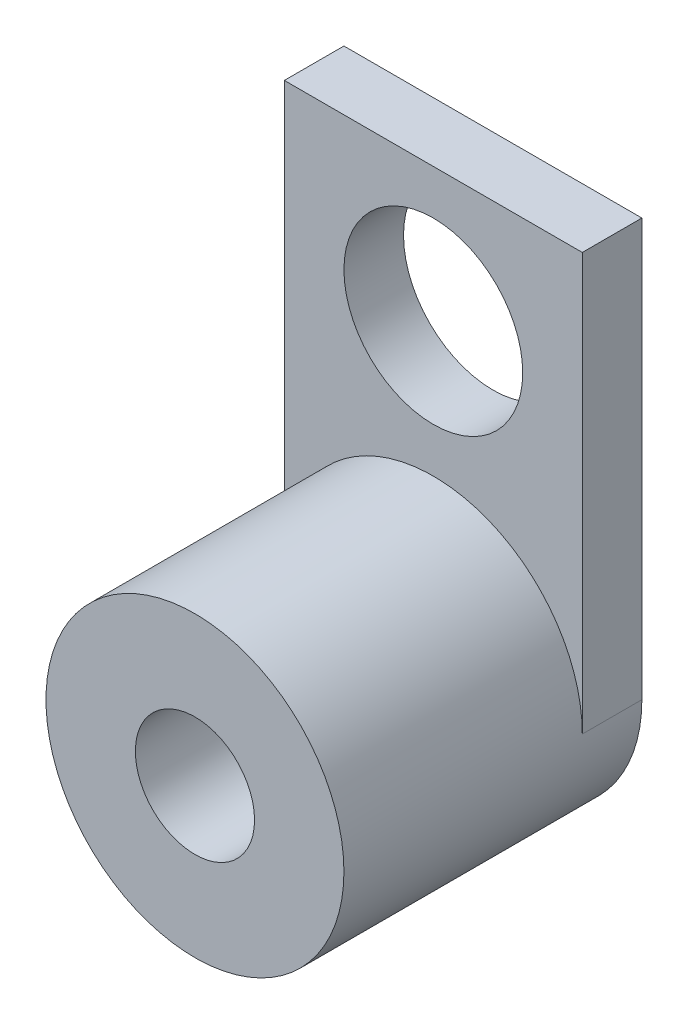
ISO-10303-21;
HEADER;
FILE_DESCRIPTION(('STEP AP214'),'2;1');
FILE_NAME('part.step','',(''),(''),'','','');
FILE_SCHEMA(('AUTOMOTIVE_DESIGN { 1 0 10303 214 1 1 1 1 }'));
ENDSEC;
DATA;
#1=APPLICATION_CONTEXT('core data for automotive mechanical design processes');
#2=APPLICATION_PROTOCOL_DEFINITION('international standard','automotive_design',2000,#1);
#3=PRODUCT_CONTEXT('',#1,'mechanical');
#4=PRODUCT('Part','Part','',(#3));
#5=PRODUCT_RELATED_PRODUCT_CATEGORY('part','',(#4));
#6=PRODUCT_DEFINITION_FORMATION('','',#4);
#7=PRODUCT_DEFINITION_CONTEXT('part definition',#1,'design');
#8=PRODUCT_DEFINITION('design','',#6,#7);
#9=PRODUCT_DEFINITION_SHAPE('','',#8);
#10=(LENGTH_UNIT() NAMED_UNIT(*) SI_UNIT(.MILLI.,.METRE.));
#11=(NAMED_UNIT(*) PLANE_ANGLE_UNIT() SI_UNIT($,.RADIAN.));
#12=(NAMED_UNIT(*) SI_UNIT($,.STERADIAN.) SOLID_ANGLE_UNIT());
#13=UNCERTAINTY_MEASURE_WITH_UNIT(LENGTH_MEASURE(1.E-05),#10,'distance_accuracy_value','');
#14=(GEOMETRIC_REPRESENTATION_CONTEXT(3) GLOBAL_UNCERTAINTY_ASSIGNED_CONTEXT((#13)) GLOBAL_UNIT_ASSIGNED_CONTEXT((#10,
#11,#12)) REPRESENTATION_CONTEXT('',''));
#15=CARTESIAN_POINT('',(0.,0.,0.));
#16=DIRECTION('',(0.,0.,1.));
#17=DIRECTION('',(1.,0.,0.));
#18=AXIS2_PLACEMENT_3D('',#15,#16,#17);
#19=CARTESIAN_POINT('',(0.,0.,127.));
#20=DIRECTION('',(0.,0.,1.));
#21=DIRECTION('',(1.,0.,0.));
#22=AXIS2_PLACEMENT_3D('',#19,#20,#21);
#23=PLANE('',#22);
#24=CARTESIAN_POINT('',(0.,0.,127.));
#25=DIRECTION('',(0.,0.,1.));
#26=DIRECTION('',(1.,0.,0.));
#27=AXIS2_PLACEMENT_3D('',#24,#25,#26);
#28=CIRCLE('',#27,63.5);
#29=CARTESIAN_POINT('',(63.5,0.,127.));
#30=VERTEX_POINT('',#29);
#31=EDGE_CURVE('E11',#30,#30,#28,.T.);
#32=ORIENTED_EDGE('',*,*,#31,.T.);
#33=EDGE_LOOP('',(#32));
#34=FACE_BOUND('',#33,.T.);
#35=CARTESIAN_POINT('',(0.,0.,127.));
#36=DIRECTION('',(0.,0.,1.));
#37=DIRECTION('',(1.,0.,0.));
#38=AXIS2_PLACEMENT_3D('',#35,#36,#37);
#39=CIRCLE('',#38,25.4);
#40=CARTESIAN_POINT('',(25.4,0.,127.));
#41=VERTEX_POINT('',#40);
#42=EDGE_CURVE('E134',#41,#41,#39,.T.);
#43=ORIENTED_EDGE('',*,*,#42,.F.);
#44=EDGE_LOOP('',(#43));
#45=FACE_BOUND('',#44,.T.);
#46=ADVANCED_FACE('F45',(#34,#45),#23,.T.);
#47=CARTESIAN_POINT('',(0.,0.,0.));
#48=DIRECTION('',(0.,0.,1.));
#49=DIRECTION('',(1.,0.,0.));
#50=AXIS2_PLACEMENT_3D('',#47,#48,#49);
#51=PLANE('',#50);
#52=CARTESIAN_POINT('',(0.,0.,0.));
#53=DIRECTION('',(0.,0.,1.));
#54=DIRECTION('',(1.,0.,0.));
#55=AXIS2_PLACEMENT_3D('',#52,#53,#54);
#56=CIRCLE('',#55,63.5);
#57=CARTESIAN_POINT('',(-63.5,0.,0.));
#58=VERTEX_POINT('',#57);
#59=CARTESIAN_POINT('',(63.5,0.,0.));
#60=VERTEX_POINT('',#59);
#61=EDGE_CURVE('E49',#58,#60,#56,.T.);
#62=ORIENTED_EDGE('',*,*,#61,.F.);
#63=DIRECTION('',(0.,-1.,0.));
#64=VECTOR('',#63,1.);
#65=CARTESIAN_POINT('',(-63.5,0.,0.));
#66=LINE('',#65,#64);
#67=CARTESIAN_POINT('',(-63.5,177.8,0.));
#68=VERTEX_POINT('',#67);
#69=EDGE_CURVE('E61',#68,#58,#66,.T.);
#70=ORIENTED_EDGE('',*,*,#69,.F.);
#71=DIRECTION('',(-1.,0.,0.));
#72=VECTOR('',#71,1.);
#73=CARTESIAN_POINT('',(-63.5,177.8,0.));
#74=LINE('',#73,#72);
#75=CARTESIAN_POINT('',(63.5,177.8,0.));
#76=VERTEX_POINT('',#75);
#77=EDGE_CURVE('E87',#76,#68,#74,.T.);
#78=ORIENTED_EDGE('',*,*,#77,.F.);
#79=DIRECTION('',(0.,1.,0.));
#80=VECTOR('',#79,1.);
#81=CARTESIAN_POINT('',(63.5,0.,0.));
#82=LINE('',#81,#80);
#83=EDGE_CURVE('E105',#60,#76,#82,.T.);
#84=ORIENTED_EDGE('',*,*,#83,.F.);
#85=EDGE_LOOP('',(#62,#70,#78,#84));
#86=FACE_BOUND('',#85,.T.);
#87=CARTESIAN_POINT('',(0.,0.,0.));
#88=DIRECTION('',(0.,0.,1.));
#89=DIRECTION('',(1.,0.,0.));
#90=AXIS2_PLACEMENT_3D('',#87,#88,#89);
#91=CIRCLE('',#90,25.4);
#92=CARTESIAN_POINT('',(25.4,0.,0.));
#93=VERTEX_POINT('',#92);
#94=EDGE_CURVE('E133',#93,#93,#91,.T.);
#95=ORIENTED_EDGE('',*,*,#94,.T.);
#96=EDGE_LOOP('',(#95));
#97=FACE_BOUND('',#96,.T.);
#98=CARTESIAN_POINT('',(0.,120.65,0.));
#99=DIRECTION('',(0.,0.,1.));
#100=DIRECTION('',(1.,0.,0.));
#101=AXIS2_PLACEMENT_3D('',#98,#99,#100);
#102=CIRCLE('',#101,38.1);
#103=CARTESIAN_POINT('',(38.1,120.65,0.));
#104=VERTEX_POINT('',#103);
#105=EDGE_CURVE('E239',#104,#104,#102,.T.);
#106=ORIENTED_EDGE('',*,*,#105,.T.);
#107=EDGE_LOOP('',(#106));
#108=FACE_BOUND('',#107,.T.);
#109=ADVANCED_FACE('F142',(#86,#97,#108),#51,.F.);
#110=CARTESIAN_POINT('',(0.,0.,127.));
#111=DIRECTION('',(0.,0.,-1.));
#112=DIRECTION('',(-1.,0.,0.));
#113=AXIS2_PLACEMENT_3D('',#110,#111,#112);
#114=CYLINDRICAL_SURFACE('',#113,63.5);
#115=ORIENTED_EDGE('',*,*,#31,.F.);
#116=EDGE_LOOP('',(#115));
#117=FACE_BOUND('',#116,.T.);
#118=CARTESIAN_POINT('',(0.,0.,25.4));
#119=DIRECTION('',(0.,0.,1.));
#120=DIRECTION('',(1.,0.,0.));
#121=AXIS2_PLACEMENT_3D('',#118,#119,#120);
#122=CIRCLE('',#121,63.5);
#123=CARTESIAN_POINT('',(63.5,0.,25.4));
#124=VERTEX_POINT('',#123);
#125=CARTESIAN_POINT('',(-63.5,0.,25.4));
#126=VERTEX_POINT('',#125);
#127=EDGE_CURVE('E91',#124,#126,#122,.T.);
#128=ORIENTED_EDGE('',*,*,#127,.T.);
#129=DIRECTION('',(0.,0.,-1.));
#130=VECTOR('',#129,1.);
#131=CARTESIAN_POINT('',(-63.5,0.,25.4));
#132=LINE('',#131,#130);
#133=EDGE_CURVE('E114',#126,#58,#132,.T.);
#134=ORIENTED_EDGE('',*,*,#133,.T.);
#135=ORIENTED_EDGE('',*,*,#61,.T.);
#136=DIRECTION('',(0.,0.,-1.));
#137=VECTOR('',#136,1.);
#138=CARTESIAN_POINT('',(63.5,0.,25.4));
#139=LINE('',#138,#137);
#140=EDGE_CURVE('E107',#124,#60,#139,.T.);
#141=ORIENTED_EDGE('',*,*,#140,.F.);
#142=EDGE_LOOP('',(#128,#134,#135,#141));
#143=FACE_BOUND('',#142,.T.);
#144=ADVANCED_FACE('F47',(#117,#143),#114,.T.);
#145=CARTESIAN_POINT('',(0.,0.,127.));
#146=DIRECTION('',(0.,0.,-1.));
#147=DIRECTION('',(-1.,0.,0.));
#148=AXIS2_PLACEMENT_3D('',#145,#146,#147);
#149=CYLINDRICAL_SURFACE('',#148,25.4);
#150=ORIENTED_EDGE('',*,*,#42,.T.);
#151=EDGE_LOOP('',(#150));
#152=FACE_BOUND('',#151,.T.);
#153=ORIENTED_EDGE('',*,*,#94,.F.);
#154=EDGE_LOOP('',(#153));
#155=FACE_BOUND('',#154,.T.);
#156=ADVANCED_FACE('F145',(#152,#155),#149,.F.);
#157=CARTESIAN_POINT('',(0.,0.,25.4));
#158=DIRECTION('',(0.,0.,1.));
#159=DIRECTION('',(1.,0.,0.));
#160=AXIS2_PLACEMENT_3D('',#157,#158,#159);
#161=PLANE('',#160);
#162=CARTESIAN_POINT('',(0.,120.65,25.4));
#163=DIRECTION('',(0.,0.,1.));
#164=DIRECTION('',(1.,0.,0.));
#165=AXIS2_PLACEMENT_3D('',#162,#163,#164);
#166=CIRCLE('',#165,38.1);
#167=CARTESIAN_POINT('',(38.1,120.65,25.4));
#168=VERTEX_POINT('',#167);
#169=EDGE_CURVE('E120',#168,#168,#166,.T.);
#170=ORIENTED_EDGE('',*,*,#169,.F.);
#171=EDGE_LOOP('',(#170));
#172=FACE_BOUND('',#171,.T.);
#173=ORIENTED_EDGE('',*,*,#127,.F.);
#174=DIRECTION('',(0.,1.,0.));
#175=VECTOR('',#174,1.);
#176=CARTESIAN_POINT('',(63.5,0.,25.4));
#177=LINE('',#176,#175);
#178=CARTESIAN_POINT('',(63.5,177.8,25.4));
#179=VERTEX_POINT('',#178);
#180=EDGE_CURVE('E93',#124,#179,#177,.T.);
#181=ORIENTED_EDGE('',*,*,#180,.T.);
#182=DIRECTION('',(-1.,0.,0.));
#183=VECTOR('',#182,1.);
#184=CARTESIAN_POINT('',(-63.5,177.8,25.4));
#185=LINE('',#184,#183);
#186=CARTESIAN_POINT('',(-63.5,177.8,25.4));
#187=VERTEX_POINT('',#186);
#188=EDGE_CURVE('E97',#179,#187,#185,.T.);
#189=ORIENTED_EDGE('',*,*,#188,.T.);
#190=DIRECTION('',(0.,-1.,0.));
#191=VECTOR('',#190,1.);
#192=CARTESIAN_POINT('',(-63.5,0.,25.4));
#193=LINE('',#192,#191);
#194=EDGE_CURVE('E70',#187,#126,#193,.T.);
#195=ORIENTED_EDGE('',*,*,#194,.T.);
#196=EDGE_LOOP('',(#173,#181,#189,#195));
#197=FACE_BOUND('',#196,.T.);
#198=ADVANCED_FACE('F95',(#172,#197),#161,.T.);
#199=CARTESIAN_POINT('',(63.5,0.,25.4));
#200=DIRECTION('',(-1.,0.,0.));
#201=DIRECTION('',(0.,-1.,0.));
#202=AXIS2_PLACEMENT_3D('',#199,#200,#201);
#203=PLANE('',#202);
#204=ORIENTED_EDGE('',*,*,#83,.T.);
#205=DIRECTION('',(0.,0.,-1.));
#206=VECTOR('',#205,1.);
#207=CARTESIAN_POINT('',(63.5,177.8,25.4));
#208=LINE('',#207,#206);
#209=EDGE_CURVE('E103',#179,#76,#208,.T.);
#210=ORIENTED_EDGE('',*,*,#209,.F.);
#211=ORIENTED_EDGE('',*,*,#180,.F.);
#212=ORIENTED_EDGE('',*,*,#140,.T.);
#213=EDGE_LOOP('',(#204,#210,#211,#212));
#214=FACE_BOUND('',#213,.T.);
#215=ADVANCED_FACE('F104',(#214),#203,.F.);
#216=CARTESIAN_POINT('',(-63.5,177.8,25.4));
#217=DIRECTION('',(0.,-1.,0.));
#218=DIRECTION('',(0.,0.,-1.));
#219=AXIS2_PLACEMENT_3D('',#216,#217,#218);
#220=PLANE('',#219);
#221=ORIENTED_EDGE('',*,*,#77,.T.);
#222=DIRECTION('',(0.,0.,-1.));
#223=VECTOR('',#222,1.);
#224=CARTESIAN_POINT('',(-63.5,177.8,25.4));
#225=LINE('',#224,#223);
#226=EDGE_CURVE('E108',#187,#68,#225,.T.);
#227=ORIENTED_EDGE('',*,*,#226,.F.);
#228=ORIENTED_EDGE('',*,*,#188,.F.);
#229=ORIENTED_EDGE('',*,*,#209,.T.);
#230=EDGE_LOOP('',(#221,#227,#228,#229));
#231=FACE_BOUND('',#230,.T.);
#232=ADVANCED_FACE('F110',(#231),#220,.F.);
#233=CARTESIAN_POINT('',(-63.5,0.,25.4));
#234=DIRECTION('',(1.,0.,0.));
#235=DIRECTION('',(0.,1.,0.));
#236=AXIS2_PLACEMENT_3D('',#233,#234,#235);
#237=PLANE('',#236);
#238=ORIENTED_EDGE('',*,*,#69,.T.);
#239=ORIENTED_EDGE('',*,*,#133,.F.);
#240=ORIENTED_EDGE('',*,*,#194,.F.);
#241=ORIENTED_EDGE('',*,*,#226,.T.);
#242=EDGE_LOOP('',(#238,#239,#240,#241));
#243=FACE_BOUND('',#242,.T.);
#244=ADVANCED_FACE('F171',(#243),#237,.F.);
#245=CARTESIAN_POINT('',(0.,120.65,25.4));
#246=DIRECTION('',(0.,0.,-1.));
#247=DIRECTION('',(-1.,0.,0.));
#248=AXIS2_PLACEMENT_3D('',#245,#246,#247);
#249=CYLINDRICAL_SURFACE('',#248,38.1);
#250=ORIENTED_EDGE('',*,*,#169,.T.);
#251=EDGE_LOOP('',(#250));
#252=FACE_BOUND('',#251,.T.);
#253=ORIENTED_EDGE('',*,*,#105,.F.);
#254=EDGE_LOOP('',(#253));
#255=FACE_BOUND('',#254,.T.);
#256=ADVANCED_FACE('F173',(#252,#255),#249,.F.);
#257=CLOSED_SHELL('',(#46,#109,#144,#156,#198,#215,#232,#244,#256));
#258=MANIFOLD_SOLID_BREP('B2',#257);
#259=ADVANCED_BREP_SHAPE_REPRESENTATION('',(#18,#258),#14);
#260=SHAPE_DEFINITION_REPRESENTATION(#9,#259);
ENDSEC;
END-ISO-10303-21;
